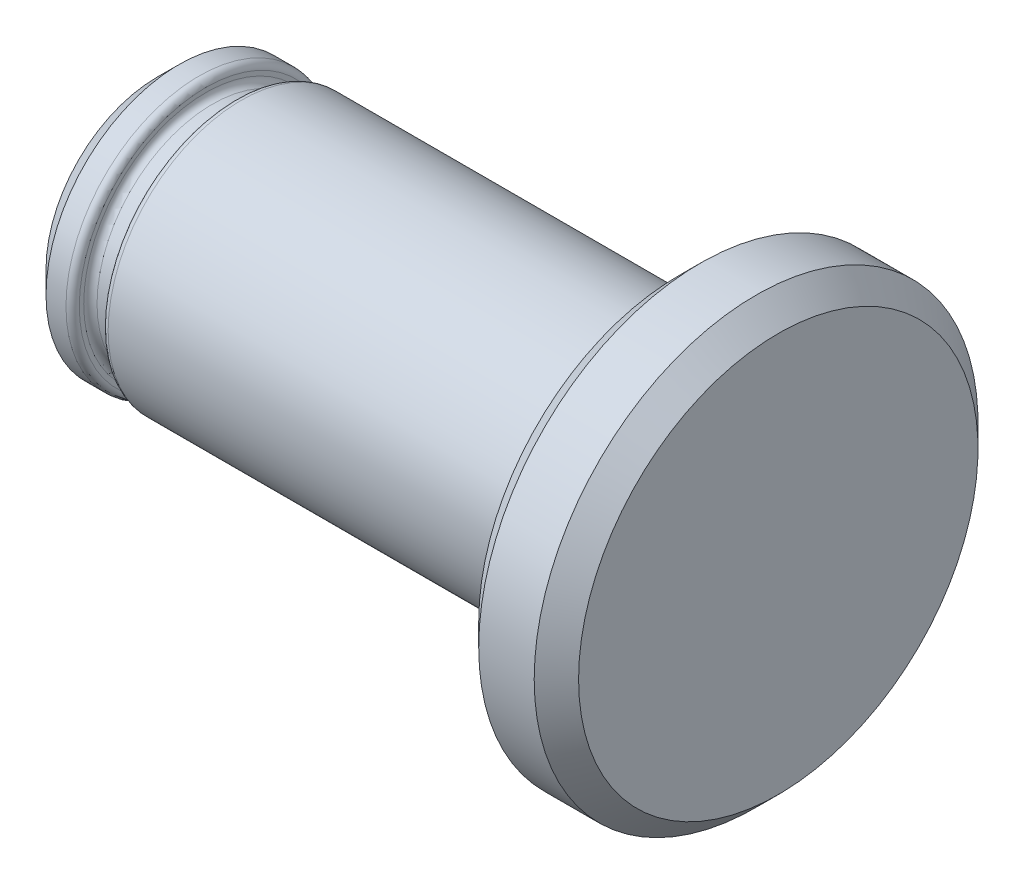
ISO-10303-21;
HEADER;
FILE_DESCRIPTION(('STEP AP214'),'2;1');
FILE_NAME('part.step','',(''),(''),'','','');
FILE_SCHEMA(('AUTOMOTIVE_DESIGN { 1 0 10303 214 1 1 1 1 }'));
ENDSEC;
DATA;
#1=APPLICATION_CONTEXT('core data for automotive mechanical design processes');
#2=APPLICATION_PROTOCOL_DEFINITION('international standard','automotive_design',2000,#1);
#3=PRODUCT_CONTEXT('',#1,'mechanical');
#4=PRODUCT('Part','Part','',(#3));
#5=PRODUCT_RELATED_PRODUCT_CATEGORY('part','',(#4));
#6=PRODUCT_DEFINITION_FORMATION('','',#4);
#7=PRODUCT_DEFINITION_CONTEXT('part definition',#1,'design');
#8=PRODUCT_DEFINITION('design','',#6,#7);
#9=PRODUCT_DEFINITION_SHAPE('','',#8);
#10=(LENGTH_UNIT() NAMED_UNIT(*) SI_UNIT(.MILLI.,.METRE.));
#11=(NAMED_UNIT(*) PLANE_ANGLE_UNIT() SI_UNIT($,.RADIAN.));
#12=(NAMED_UNIT(*) SI_UNIT($,.STERADIAN.) SOLID_ANGLE_UNIT());
#13=UNCERTAINTY_MEASURE_WITH_UNIT(LENGTH_MEASURE(1.E-05),#10,'distance_accuracy_value','');
#14=(GEOMETRIC_REPRESENTATION_CONTEXT(3) GLOBAL_UNCERTAINTY_ASSIGNED_CONTEXT((#13)) GLOBAL_UNIT_ASSIGNED_CONTEXT((#10,
#11,#12)) REPRESENTATION_CONTEXT('',''));
#15=CARTESIAN_POINT('',(0.,0.,0.));
#16=DIRECTION('',(0.,0.,1.));
#17=DIRECTION('',(1.,0.,0.));
#18=AXIS2_PLACEMENT_3D('',#15,#16,#17);
#19=CARTESIAN_POINT('',(4.5,0.,9.));
#20=DIRECTION('',(1.,0.,0.));
#21=DIRECTION('',(0.,0.,-1.));
#22=AXIS2_PLACEMENT_3D('',#19,#20,#21);
#23=PLANE('',#22);
#24=CARTESIAN_POINT('',(4.5,0.,0.));
#25=DIRECTION('',(-1.,0.,0.));
#26=DIRECTION('',(0.,0.,1.));
#27=AXIS2_PLACEMENT_3D('',#24,#25,#26);
#28=CIRCLE('',#27,9.00000000000001);
#29=CARTESIAN_POINT('',(4.5,0.,9.));
#30=VERTEX_POINT('',#29);
#31=EDGE_CURVE('E10',#30,#30,#28,.T.);
#32=ORIENTED_EDGE('',*,*,#31,.F.);
#33=EDGE_LOOP('',(#32));
#34=FACE_BOUND('',#33,.T.);
#35=ADVANCED_FACE('F43',(#34),#23,.T.);
#36=CARTESIAN_POINT('',(3.5,0.,0.));
#37=DIRECTION('',(-1.,0.,0.));
#38=DIRECTION('',(0.,0.,1.));
#39=AXIS2_PLACEMENT_3D('',#36,#37,#38);
#40=CONICAL_SURFACE('',#39,10.,0.785398163397447);
#41=ORIENTED_EDGE('',*,*,#31,.T.);
#42=EDGE_LOOP('',(#41));
#43=FACE_BOUND('',#42,.T.);
#44=CARTESIAN_POINT('',(3.5,0.,0.));
#45=DIRECTION('',(-1.,0.,0.));
#46=DIRECTION('',(0.,0.,1.));
#47=AXIS2_PLACEMENT_3D('',#44,#45,#46);
#48=CIRCLE('',#47,10.);
#49=CARTESIAN_POINT('',(3.5,0.,10.));
#50=VERTEX_POINT('',#49);
#51=EDGE_CURVE('E50',#50,#50,#48,.T.);
#52=ORIENTED_EDGE('',*,*,#51,.F.);
#53=EDGE_LOOP('',(#52));
#54=FACE_BOUND('',#53,.T.);
#55=ADVANCED_FACE('F131',(#43,#54),#40,.T.);
#56=CARTESIAN_POINT('',(-23.5,0.,0.));
#57=DIRECTION('',(-1.,0.,0.));
#58=DIRECTION('',(0.,0.,1.));
#59=AXIS2_PLACEMENT_3D('',#56,#57,#58);
#60=CYLINDRICAL_SURFACE('',#59,10.);
#61=ORIENTED_EDGE('',*,*,#51,.T.);
#62=EDGE_LOOP('',(#61));
#63=FACE_BOUND('',#62,.T.);
#64=CARTESIAN_POINT('',(1.,0.,0.));
#65=DIRECTION('',(-1.,0.,0.));
#66=DIRECTION('',(0.,0.,1.));
#67=AXIS2_PLACEMENT_3D('',#64,#65,#66);
#68=CIRCLE('',#67,10.);
#69=CARTESIAN_POINT('',(1.,0.,10.));
#70=VERTEX_POINT('',#69);
#71=EDGE_CURVE('E55',#70,#70,#68,.T.);
#72=ORIENTED_EDGE('',*,*,#71,.F.);
#73=EDGE_LOOP('',(#72));
#74=FACE_BOUND('',#73,.T.);
#75=ADVANCED_FACE('F136',(#63,#74),#60,.T.);
#76=CARTESIAN_POINT('',(0.,0.,0.));
#77=DIRECTION('',(1.,0.,0.));
#78=DIRECTION('',(0.,0.,-1.));
#79=AXIS2_PLACEMENT_3D('',#76,#77,#78);
#80=CONICAL_SURFACE('',#79,9.00000000000001,0.785398163397447);
#81=ORIENTED_EDGE('',*,*,#71,.T.);
#82=EDGE_LOOP('',(#81));
#83=FACE_BOUND('',#82,.T.);
#84=CARTESIAN_POINT('',(0.,0.,0.));
#85=DIRECTION('',(-1.,0.,0.));
#86=DIRECTION('',(0.,0.,1.));
#87=AXIS2_PLACEMENT_3D('',#84,#85,#86);
#88=CIRCLE('',#87,9.00000000000001);
#89=CARTESIAN_POINT('',(0.,0.,9.));
#90=VERTEX_POINT('',#89);
#91=EDGE_CURVE('E60',#90,#90,#88,.T.);
#92=ORIENTED_EDGE('',*,*,#91,.F.);
#93=EDGE_LOOP('',(#92));
#94=FACE_BOUND('',#93,.T.);
#95=ADVANCED_FACE('F140',(#83,#94),#80,.T.);
#96=CARTESIAN_POINT('',(0.,0.,9.));
#97=DIRECTION('',(-1.,0.,0.));
#98=DIRECTION('',(0.,0.,1.));
#99=AXIS2_PLACEMENT_3D('',#96,#97,#98);
#100=PLANE('',#99);
#101=ORIENTED_EDGE('',*,*,#91,.T.);
#102=EDGE_LOOP('',(#101));
#103=FACE_BOUND('',#102,.T.);
#104=CARTESIAN_POINT('',(0.,0.,0.));
#105=DIRECTION('',(-1.,0.,0.));
#106=DIRECTION('',(0.,0.,1.));
#107=AXIS2_PLACEMENT_3D('',#104,#105,#106);
#108=CIRCLE('',#107,8.);
#109=CARTESIAN_POINT('',(0.,0.,8.));
#110=VERTEX_POINT('',#109);
#111=EDGE_CURVE('E66',#110,#110,#108,.T.);
#112=ORIENTED_EDGE('',*,*,#111,.F.);
#113=EDGE_LOOP('',(#112));
#114=FACE_BOUND('',#113,.T.);
#115=ADVANCED_FACE('F146',(#103,#114),#100,.T.);
#116=CARTESIAN_POINT('',(-2.,0.,0.));
#117=DIRECTION('',(-1.,0.,0.));
#118=DIRECTION('',(0.,0.,1.));
#119=AXIS2_PLACEMENT_3D('',#116,#117,#118);
#120=TOROIDAL_SURFACE('',#119,8.,2.);
#121=ORIENTED_EDGE('',*,*,#111,.T.);
#122=EDGE_LOOP('',(#121));
#123=FACE_BOUND('',#122,.T.);
#124=CARTESIAN_POINT('',(-2.,0.,0.));
#125=DIRECTION('',(-1.,0.,0.));
#126=DIRECTION('',(0.,0.,1.));
#127=AXIS2_PLACEMENT_3D('',#124,#125,#126);
#128=CIRCLE('',#127,6.);
#129=CARTESIAN_POINT('',(-2.,0.,6.));
#130=VERTEX_POINT('',#129);
#131=EDGE_CURVE('E70',#130,#130,#128,.T.);
#132=ORIENTED_EDGE('',*,*,#131,.F.);
#133=EDGE_LOOP('',(#132));
#134=FACE_BOUND('',#133,.T.);
#135=ADVANCED_FACE('F150',(#123,#134),#120,.F.);
#136=CARTESIAN_POINT('',(-23.5,0.,0.));
#137=DIRECTION('',(-1.,0.,0.));
#138=DIRECTION('',(0.,0.,1.));
#139=AXIS2_PLACEMENT_3D('',#136,#137,#138);
#140=CYLINDRICAL_SURFACE('',#139,6.);
#141=ORIENTED_EDGE('',*,*,#131,.T.);
#142=EDGE_LOOP('',(#141));
#143=FACE_BOUND('',#142,.T.);
#144=CARTESIAN_POINT('',(-19.7,0.,0.));
#145=DIRECTION('',(-1.,0.,0.));
#146=DIRECTION('',(0.,0.,1.));
#147=AXIS2_PLACEMENT_3D('',#144,#145,#146);
#148=CIRCLE('',#147,6.);
#149=CARTESIAN_POINT('',(-19.7,0.,6.));
#150=VERTEX_POINT('',#149);
#151=EDGE_CURVE('E74',#150,#150,#148,.T.);
#152=ORIENTED_EDGE('',*,*,#151,.F.);
#153=EDGE_LOOP('',(#152));
#154=FACE_BOUND('',#153,.T.);
#155=ADVANCED_FACE('F154',(#143,#154),#140,.T.);
#156=CARTESIAN_POINT('',(-19.7,0.,0.));
#157=DIRECTION('',(-1.,0.,0.));
#158=DIRECTION('',(0.,0.,1.));
#159=AXIS2_PLACEMENT_3D('',#156,#157,#158);
#160=TOROIDAL_SURFACE('',#159,5.7,0.300000000000001);
#161=ORIENTED_EDGE('',*,*,#151,.T.);
#162=EDGE_LOOP('',(#161));
#163=FACE_BOUND('',#162,.T.);
#164=CARTESIAN_POINT('',(-20.,0.,0.));
#165=DIRECTION('',(-1.,0.,0.));
#166=DIRECTION('',(0.,0.,1.));
#167=AXIS2_PLACEMENT_3D('',#164,#165,#166);
#168=CIRCLE('',#167,5.7);
#169=CARTESIAN_POINT('',(-20.,0.,5.7));
#170=VERTEX_POINT('',#169);
#171=EDGE_CURVE('E78',#170,#170,#168,.T.);
#172=ORIENTED_EDGE('',*,*,#171,.F.);
#173=EDGE_LOOP('',(#172));
#174=FACE_BOUND('',#173,.T.);
#175=ADVANCED_FACE('F158',(#163,#174),#160,.T.);
#176=CARTESIAN_POINT('',(-20.,0.,5.5));
#177=DIRECTION('',(-1.,0.,0.));
#178=DIRECTION('',(0.,0.,1.));
#179=AXIS2_PLACEMENT_3D('',#176,#177,#178);
#180=PLANE('',#179);
#181=ORIENTED_EDGE('',*,*,#171,.T.);
#182=EDGE_LOOP('',(#181));
#183=FACE_BOUND('',#182,.T.);
#184=CARTESIAN_POINT('',(-20.,0.,0.));
#185=DIRECTION('',(-1.,0.,0.));
#186=DIRECTION('',(0.,0.,1.));
#187=AXIS2_PLACEMENT_3D('',#184,#185,#186);
#188=CIRCLE('',#187,5.5);
#189=CARTESIAN_POINT('',(-20.,0.,5.5));
#190=VERTEX_POINT('',#189);
#191=EDGE_CURVE('E82',#190,#190,#188,.T.);
#192=ORIENTED_EDGE('',*,*,#191,.F.);
#193=EDGE_LOOP('',(#192));
#194=FACE_BOUND('',#193,.T.);
#195=ADVANCED_FACE('F162',(#183,#194),#180,.T.);
#196=CARTESIAN_POINT('',(-20.3,0.,0.));
#197=DIRECTION('',(-1.,0.,0.));
#198=DIRECTION('',(0.,0.,1.));
#199=AXIS2_PLACEMENT_3D('',#196,#197,#198);
#200=TOROIDAL_SURFACE('',#199,5.5,0.3);
#201=ORIENTED_EDGE('',*,*,#191,.T.);
#202=EDGE_LOOP('',(#201));
#203=FACE_BOUND('',#202,.T.);
#204=CARTESIAN_POINT('',(-20.3,0.,0.));
#205=DIRECTION('',(-1.,0.,0.));
#206=DIRECTION('',(0.,0.,1.));
#207=AXIS2_PLACEMENT_3D('',#204,#205,#206);
#208=CIRCLE('',#207,5.2);
#209=CARTESIAN_POINT('',(-20.3,0.,5.2));
#210=VERTEX_POINT('',#209);
#211=EDGE_CURVE('E86',#210,#210,#208,.T.);
#212=ORIENTED_EDGE('',*,*,#211,.F.);
#213=EDGE_LOOP('',(#212));
#214=FACE_BOUND('',#213,.T.);
#215=ADVANCED_FACE('F166',(#203,#214),#200,.F.);
#216=CARTESIAN_POINT('',(-23.5,0.,0.));
#217=DIRECTION('',(-1.,0.,0.));
#218=DIRECTION('',(0.,0.,1.));
#219=AXIS2_PLACEMENT_3D('',#216,#217,#218);
#220=CYLINDRICAL_SURFACE('',#219,5.2);
#221=ORIENTED_EDGE('',*,*,#211,.T.);
#222=EDGE_LOOP('',(#221));
#223=FACE_BOUND('',#222,.T.);
#224=CARTESIAN_POINT('',(-21.,0.,0.));
#225=DIRECTION('',(-1.,0.,0.));
#226=DIRECTION('',(0.,0.,1.));
#227=AXIS2_PLACEMENT_3D('',#224,#225,#226);
#228=CIRCLE('',#227,5.2);
#229=CARTESIAN_POINT('',(-21.,0.,5.2));
#230=VERTEX_POINT('',#229);
#231=EDGE_CURVE('E90',#230,#230,#228,.T.);
#232=ORIENTED_EDGE('',*,*,#231,.F.);
#233=EDGE_LOOP('',(#232));
#234=FACE_BOUND('',#233,.T.);
#235=ADVANCED_FACE('F170',(#223,#234),#220,.T.);
#236=CARTESIAN_POINT('',(-21.,0.,0.));
#237=DIRECTION('',(-1.,0.,0.));
#238=DIRECTION('',(0.,0.,1.));
#239=AXIS2_PLACEMENT_3D('',#236,#237,#238);
#240=TOROIDAL_SURFACE('',#239,5.5,0.3);
#241=ORIENTED_EDGE('',*,*,#231,.T.);
#242=EDGE_LOOP('',(#241));
#243=FACE_BOUND('',#242,.T.);
#244=CARTESIAN_POINT('',(-21.3,0.,0.));
#245=DIRECTION('',(-1.,0.,0.));
#246=DIRECTION('',(0.,0.,1.));
#247=AXIS2_PLACEMENT_3D('',#244,#245,#246);
#248=CIRCLE('',#247,5.5);
#249=CARTESIAN_POINT('',(-21.3,0.,5.5));
#250=VERTEX_POINT('',#249);
#251=EDGE_CURVE('E94',#250,#250,#248,.T.);
#252=ORIENTED_EDGE('',*,*,#251,.F.);
#253=EDGE_LOOP('',(#252));
#254=FACE_BOUND('',#253,.T.);
#255=ADVANCED_FACE('F174',(#243,#254),#240,.F.);
#256=CARTESIAN_POINT('',(-21.3,0.,5.7));
#257=DIRECTION('',(1.,0.,0.));
#258=DIRECTION('',(0.,0.,-1.));
#259=AXIS2_PLACEMENT_3D('',#256,#257,#258);
#260=PLANE('',#259);
#261=ORIENTED_EDGE('',*,*,#251,.T.);
#262=EDGE_LOOP('',(#261));
#263=FACE_BOUND('',#262,.T.);
#264=CARTESIAN_POINT('',(-21.3,0.,0.));
#265=DIRECTION('',(-1.,0.,0.));
#266=DIRECTION('',(0.,0.,1.));
#267=AXIS2_PLACEMENT_3D('',#264,#265,#266);
#268=CIRCLE('',#267,5.7);
#269=CARTESIAN_POINT('',(-21.3,0.,5.7));
#270=VERTEX_POINT('',#269);
#271=EDGE_CURVE('E98',#270,#270,#268,.T.);
#272=ORIENTED_EDGE('',*,*,#271,.F.);
#273=EDGE_LOOP('',(#272));
#274=FACE_BOUND('',#273,.T.);
#275=ADVANCED_FACE('F178',(#263,#274),#260,.T.);
#276=CARTESIAN_POINT('',(-21.6,0.,0.));
#277=DIRECTION('',(-1.,0.,0.));
#278=DIRECTION('',(0.,0.,1.));
#279=AXIS2_PLACEMENT_3D('',#276,#277,#278);
#280=TOROIDAL_SURFACE('',#279,5.7,0.300000000000001);
#281=ORIENTED_EDGE('',*,*,#271,.T.);
#282=EDGE_LOOP('',(#281));
#283=FACE_BOUND('',#282,.T.);
#284=CARTESIAN_POINT('',(-21.6,0.,0.));
#285=DIRECTION('',(-1.,0.,0.));
#286=DIRECTION('',(0.,0.,1.));
#287=AXIS2_PLACEMENT_3D('',#284,#285,#286);
#288=CIRCLE('',#287,6.);
#289=CARTESIAN_POINT('',(-21.6,0.,6.));
#290=VERTEX_POINT('',#289);
#291=EDGE_CURVE('E102',#290,#290,#288,.T.);
#292=ORIENTED_EDGE('',*,*,#291,.F.);
#293=EDGE_LOOP('',(#292));
#294=FACE_BOUND('',#293,.T.);
#295=ADVANCED_FACE('F127',(#283,#294),#280,.T.);
#296=CARTESIAN_POINT('',(-23.5,0.,0.));
#297=DIRECTION('',(-1.,0.,0.));
#298=DIRECTION('',(0.,0.,1.));
#299=AXIS2_PLACEMENT_3D('',#296,#297,#298);
#300=CYLINDRICAL_SURFACE('',#299,6.);
#301=ORIENTED_EDGE('',*,*,#291,.T.);
#302=EDGE_LOOP('',(#301));
#303=FACE_BOUND('',#302,.T.);
#304=CARTESIAN_POINT('',(-22.5,0.,0.));
#305=DIRECTION('',(-1.,0.,0.));
#306=DIRECTION('',(0.,0.,1.));
#307=AXIS2_PLACEMENT_3D('',#304,#305,#306);
#308=CIRCLE('',#307,6.);
#309=CARTESIAN_POINT('',(-22.5,0.,6.));
#310=VERTEX_POINT('',#309);
#311=EDGE_CURVE('E106',#310,#310,#308,.T.);
#312=ORIENTED_EDGE('',*,*,#311,.F.);
#313=EDGE_LOOP('',(#312));
#314=FACE_BOUND('',#313,.T.);
#315=ADVANCED_FACE('F119',(#303,#314),#300,.T.);
#316=CARTESIAN_POINT('',(-23.5,0.,0.));
#317=DIRECTION('',(1.,0.,0.));
#318=DIRECTION('',(0.,0.,-1.));
#319=AXIS2_PLACEMENT_3D('',#316,#317,#318);
#320=CONICAL_SURFACE('',#319,5.,0.785398163397448);
#321=ORIENTED_EDGE('',*,*,#311,.T.);
#322=EDGE_LOOP('',(#321));
#323=FACE_BOUND('',#322,.T.);
#324=CARTESIAN_POINT('',(-23.5,0.,0.));
#325=DIRECTION('',(-1.,0.,0.));
#326=DIRECTION('',(0.,0.,1.));
#327=AXIS2_PLACEMENT_3D('',#324,#325,#326);
#328=CIRCLE('',#327,5.);
#329=CARTESIAN_POINT('',(-23.5,0.,5.));
#330=VERTEX_POINT('',#329);
#331=EDGE_CURVE('E110',#330,#330,#328,.T.);
#332=ORIENTED_EDGE('',*,*,#331,.F.);
#333=EDGE_LOOP('',(#332));
#334=FACE_BOUND('',#333,.T.);
#335=ADVANCED_FACE('F117',(#323,#334),#320,.T.);
#336=CARTESIAN_POINT('',(-23.5,0.,0.));
#337=DIRECTION('',(-1.,0.,0.));
#338=DIRECTION('',(0.,0.,1.));
#339=AXIS2_PLACEMENT_3D('',#336,#337,#338);
#340=PLANE('',#339);
#341=ORIENTED_EDGE('',*,*,#331,.T.);
#342=EDGE_LOOP('',(#341));
#343=FACE_BOUND('',#342,.T.);
#344=ADVANCED_FACE('F115',(#343),#340,.T.);
#345=CLOSED_SHELL('',(#35,#55,#75,#95,#115,#135,#155,#175,#195,#215,#235,#255,#275,#295,#315,
#335,#344));
#346=MANIFOLD_SOLID_BREP('B2',#345);
#347=ADVANCED_BREP_SHAPE_REPRESENTATION('',(#18,#346),#14);
#348=SHAPE_DEFINITION_REPRESENTATION(#9,#347);
ENDSEC;
END-ISO-10303-21;
